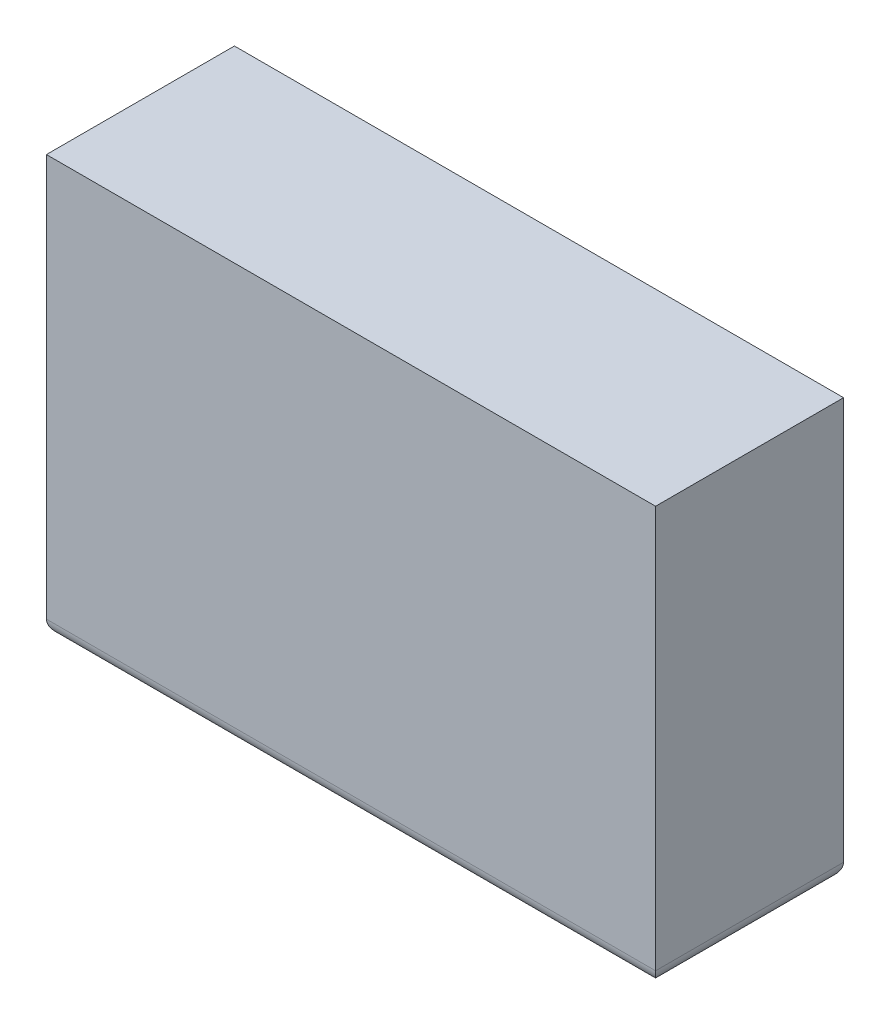
ISO-10303-21;
HEADER;
FILE_DESCRIPTION(('STEP AP214'),'2;1');
FILE_NAME('part.step','',(''),(''),'','','');
FILE_SCHEMA(('AUTOMOTIVE_DESIGN { 1 0 10303 214 1 1 1 1 }'));
ENDSEC;
DATA;
#1=APPLICATION_CONTEXT('core data for automotive mechanical design processes');
#2=APPLICATION_PROTOCOL_DEFINITION('international standard','automotive_design',2000,#1);
#3=PRODUCT_CONTEXT('',#1,'mechanical');
#4=PRODUCT('Part','Part','',(#3));
#5=PRODUCT_RELATED_PRODUCT_CATEGORY('part','',(#4));
#6=PRODUCT_DEFINITION_FORMATION('','',#4);
#7=PRODUCT_DEFINITION_CONTEXT('part definition',#1,'design');
#8=PRODUCT_DEFINITION('design','',#6,#7);
#9=PRODUCT_DEFINITION_SHAPE('','',#8);
#10=(LENGTH_UNIT() NAMED_UNIT(*) SI_UNIT(.MILLI.,.METRE.));
#11=(NAMED_UNIT(*) PLANE_ANGLE_UNIT() SI_UNIT($,.RADIAN.));
#12=(NAMED_UNIT(*) SI_UNIT($,.STERADIAN.) SOLID_ANGLE_UNIT());
#13=UNCERTAINTY_MEASURE_WITH_UNIT(LENGTH_MEASURE(1.E-05),#10,'distance_accuracy_value','');
#14=(GEOMETRIC_REPRESENTATION_CONTEXT(3) GLOBAL_UNCERTAINTY_ASSIGNED_CONTEXT((#13)) GLOBAL_UNIT_ASSIGNED_CONTEXT((#10,
#11,#12)) REPRESENTATION_CONTEXT('',''));
#15=CARTESIAN_POINT('',(0.,0.,0.));
#16=DIRECTION('',(0.,0.,1.));
#17=DIRECTION('',(1.,0.,0.));
#18=AXIS2_PLACEMENT_3D('',#15,#16,#17);
#19=CARTESIAN_POINT('',(-57.,-10.,-8.55043859649121));
#20=DIRECTION('',(0.,1.,0.));
#21=DIRECTION('',(0.,0.,1.));
#22=AXIS2_PLACEMENT_3D('',#19,#20,#21);
#23=CYLINDRICAL_SURFACE('',#22,5.);
#24=CARTESIAN_POINT('',(-57.,-10.,-8.55043859649121));
#25=DIRECTION('',(0.,1.,0.));
#26=DIRECTION('',(0.,0.,1.));
#27=AXIS2_PLACEMENT_3D('',#24,#25,#26);
#28=CIRCLE('',#27,5.);
#29=CARTESIAN_POINT('',(-57.,-10.,-3.55043859649121));
#30=VERTEX_POINT('',#29);
#31=EDGE_CURVE('E212',#30,#30,#28,.T.);
#32=ORIENTED_EDGE('',*,*,#31,.T.);
#33=EDGE_LOOP('',(#32));
#34=FACE_BOUND('',#33,.T.);
#35=CARTESIAN_POINT('',(-57.,0.,-8.55043859649121));
#36=DIRECTION('',(0.,1.,0.));
#37=DIRECTION('',(0.,0.,1.));
#38=AXIS2_PLACEMENT_3D('',#35,#36,#37);
#39=CIRCLE('',#38,5.);
#40=CARTESIAN_POINT('',(-57.,0.,-3.55043859649121));
#41=VERTEX_POINT('',#40);
#42=EDGE_CURVE('E147',#41,#41,#39,.T.);
#43=ORIENTED_EDGE('',*,*,#42,.F.);
#44=EDGE_LOOP('',(#43));
#45=FACE_BOUND('',#44,.T.);
#46=ADVANCED_FACE('F63',(#34,#45),#23,.T.);
#47=CARTESIAN_POINT('',(0.,-10.,0.));
#48=DIRECTION('',(0.,1.,0.));
#49=DIRECTION('',(0.,0.,1.));
#50=AXIS2_PLACEMENT_3D('',#47,#48,#49);
#51=PLANE('',#50);
#52=ORIENTED_EDGE('',*,*,#31,.F.);
#53=EDGE_LOOP('',(#52));
#54=FACE_BOUND('',#53,.T.);
#55=ADVANCED_FACE('F273',(#54),#51,.F.);
#56=CARTESIAN_POINT('',(-81.,4.,0.));
#57=DIRECTION('',(-1.,0.,0.));
#58=DIRECTION('',(0.,0.,1.));
#59=AXIS2_PLACEMENT_3D('',#56,#57,#58);
#60=PLANE('',#59);
#61=DIRECTION('',(0.,0.,-1.));
#62=VECTOR('',#61,1.);
#63=CARTESIAN_POINT('',(-81.,4.,16.4495614035088));
#64=LINE('',#63,#62);
#65=CARTESIAN_POINT('',(-81.,4.,-33.5504385964912));
#66=VERTEX_POINT('',#65);
#67=CARTESIAN_POINT('',(-81.,4.,16.4495614035088));
#68=VERTEX_POINT('',#67);
#69=EDGE_CURVE('E145',#66,#68,#64,.F.);
#70=ORIENTED_EDGE('',*,*,#69,.T.);
#71=DIRECTION('',(0.,-1.,0.));
#72=VECTOR('',#71,1.);
#73=CARTESIAN_POINT('',(-81.,4.,16.4495614035088));
#74=LINE('',#73,#72);
#75=CARTESIAN_POINT('',(-81.,111.,16.4495614035088));
#76=VERTEX_POINT('',#75);
#77=EDGE_CURVE('E86',#76,#68,#74,.T.);
#78=ORIENTED_EDGE('',*,*,#77,.F.);
#79=DIRECTION('',(0.,0.,1.));
#80=VECTOR('',#79,1.);
#81=CARTESIAN_POINT('',(-81.,111.,-33.5504385964912));
#82=LINE('',#81,#80);
#83=CARTESIAN_POINT('',(-81.,111.,-33.5504385964912));
#84=VERTEX_POINT('',#83);
#85=EDGE_CURVE('E143',#84,#76,#82,.T.);
#86=ORIENTED_EDGE('',*,*,#85,.F.);
#87=DIRECTION('',(0.,-1.,0.));
#88=VECTOR('',#87,1.);
#89=CARTESIAN_POINT('',(-81.,4.,-33.5504385964912));
#90=LINE('',#89,#88);
#91=EDGE_CURVE('E205',#84,#66,#90,.T.);
#92=ORIENTED_EDGE('',*,*,#91,.T.);
#93=EDGE_LOOP('',(#70,#78,#86,#92));
#94=FACE_BOUND('',#93,.T.);
#95=ADVANCED_FACE('F141',(#94),#60,.T.);
#96=CARTESIAN_POINT('',(0.,4.,16.4495614035088));
#97=DIRECTION('',(0.,0.,-1.));
#98=DIRECTION('',(-1.,0.,0.));
#99=AXIS2_PLACEMENT_3D('',#96,#97,#98);
#100=PLANE('',#99);
#101=DIRECTION('',(1.,0.,0.));
#102=VECTOR('',#101,1.);
#103=CARTESIAN_POINT('',(0.,4.,16.4495614035088));
#104=LINE('',#103,#102);
#105=CARTESIAN_POINT('',(81.,4.,16.4495614035088));
#106=VERTEX_POINT('',#105);
#107=EDGE_CURVE('E12',#68,#106,#104,.T.);
#108=ORIENTED_EDGE('',*,*,#107,.T.);
#109=DIRECTION('',(0.,-1.,0.));
#110=VECTOR('',#109,1.);
#111=CARTESIAN_POINT('',(81.,4.,16.4495614035088));
#112=LINE('',#111,#110);
#113=CARTESIAN_POINT('',(81.,111.,16.4495614035088));
#114=VERTEX_POINT('',#113);
#115=EDGE_CURVE('E80',#114,#106,#112,.T.);
#116=ORIENTED_EDGE('',*,*,#115,.F.);
#117=DIRECTION('',(1.,0.,0.));
#118=VECTOR('',#117,1.);
#119=CARTESIAN_POINT('',(-81.,111.,16.4495614035088));
#120=LINE('',#119,#118);
#121=EDGE_CURVE('E150',#76,#114,#120,.T.);
#122=ORIENTED_EDGE('',*,*,#121,.F.);
#123=ORIENTED_EDGE('',*,*,#77,.T.);
#124=EDGE_LOOP('',(#108,#116,#122,#123));
#125=FACE_BOUND('',#124,.T.);
#126=ADVANCED_FACE('F151',(#125),#100,.F.);
#127=CARTESIAN_POINT('',(81.,4.,0.));
#128=DIRECTION('',(-1.,0.,0.));
#129=DIRECTION('',(0.,0.,1.));
#130=AXIS2_PLACEMENT_3D('',#127,#128,#129);
#131=PLANE('',#130);
#132=DIRECTION('',(0.,0.,-1.));
#133=VECTOR('',#132,1.);
#134=CARTESIAN_POINT('',(81.,4.,0.));
#135=LINE('',#134,#133);
#136=CARTESIAN_POINT('',(81.,4.,-33.5504385964912));
#137=VERTEX_POINT('',#136);
#138=EDGE_CURVE('E72',#106,#137,#135,.T.);
#139=ORIENTED_EDGE('',*,*,#138,.T.);
#140=DIRECTION('',(0.,-1.,0.));
#141=VECTOR('',#140,1.);
#142=CARTESIAN_POINT('',(81.,4.,-33.5504385964912));
#143=LINE('',#142,#141);
#144=CARTESIAN_POINT('',(81.,111.,-33.5504385964912));
#145=VERTEX_POINT('',#144);
#146=EDGE_CURVE('E209',#145,#137,#143,.T.);
#147=ORIENTED_EDGE('',*,*,#146,.F.);
#148=DIRECTION('',(0.,0.,-1.));
#149=VECTOR('',#148,1.);
#150=CARTESIAN_POINT('',(81.,111.,-33.5504385964912));
#151=LINE('',#150,#149);
#152=EDGE_CURVE('E154',#114,#145,#151,.T.);
#153=ORIENTED_EDGE('',*,*,#152,.F.);
#154=ORIENTED_EDGE('',*,*,#115,.T.);
#155=EDGE_LOOP('',(#139,#147,#153,#154));
#156=FACE_BOUND('',#155,.T.);
#157=ADVANCED_FACE('F252',(#156),#131,.F.);
#158=CARTESIAN_POINT('',(0.,4.,-33.5504385964912));
#159=DIRECTION('',(0.,0.,-1.));
#160=DIRECTION('',(-1.,0.,0.));
#161=AXIS2_PLACEMENT_3D('',#158,#159,#160);
#162=PLANE('',#161);
#163=CARTESIAN_POINT('',(0.,53.4883121563414,-33.5504385964912));
#164=DIRECTION('',(0.,0.,-1.));
#165=DIRECTION('',(-1.,0.,0.));
#166=AXIS2_PLACEMENT_3D('',#163,#164,#165);
#167=CIRCLE('',#166,5.);
#168=CARTESIAN_POINT('',(-5.,53.4883121563414,-33.5504385964912));
#169=VERTEX_POINT('',#168);
#170=EDGE_CURVE('E164',#169,#169,#167,.T.);
#171=ORIENTED_EDGE('',*,*,#170,.F.);
#172=EDGE_LOOP('',(#171));
#173=FACE_BOUND('',#172,.T.);
#174=DIRECTION('',(1.,0.,0.));
#175=VECTOR('',#174,1.);
#176=CARTESIAN_POINT('',(-81.,4.,-33.5504385964912));
#177=LINE('',#176,#175);
#178=EDGE_CURVE('E226',#137,#66,#177,.F.);
#179=ORIENTED_EDGE('',*,*,#178,.T.);
#180=ORIENTED_EDGE('',*,*,#91,.F.);
#181=DIRECTION('',(-1.,0.,0.));
#182=VECTOR('',#181,1.);
#183=CARTESIAN_POINT('',(-81.,111.,-33.5504385964912));
#184=LINE('',#183,#182);
#185=EDGE_CURVE('E159',#145,#84,#184,.T.);
#186=ORIENTED_EDGE('',*,*,#185,.F.);
#187=ORIENTED_EDGE('',*,*,#146,.T.);
#188=EDGE_LOOP('',(#179,#180,#186,#187));
#189=FACE_BOUND('',#188,.T.);
#190=ADVANCED_FACE('F257',(#173,#189),#162,.T.);
#191=CARTESIAN_POINT('',(0.,0.,0.));
#192=DIRECTION('',(0.,1.,0.));
#193=DIRECTION('',(0.,0.,1.));
#194=AXIS2_PLACEMENT_3D('',#191,#192,#193);
#195=PLANE('',#194);
#196=DIRECTION('',(0.,0.,-1.));
#197=VECTOR('',#196,1.);
#198=CARTESIAN_POINT('',(-77.,0.,-33.5504385964912));
#199=LINE('',#198,#197);
#200=CARTESIAN_POINT('',(-77.,0.,12.4495614035088));
#201=VERTEX_POINT('',#200);
#202=CARTESIAN_POINT('',(-77.,0.,-29.5504385964912));
#203=VERTEX_POINT('',#202);
#204=EDGE_CURVE('E221',#201,#203,#199,.T.);
#205=ORIENTED_EDGE('',*,*,#204,.T.);
#206=DIRECTION('',(1.,0.,0.));
#207=VECTOR('',#206,1.);
#208=CARTESIAN_POINT('',(81.,0.,-29.5504385964912));
#209=LINE('',#208,#207);
#210=CARTESIAN_POINT('',(77.,0.,-29.5504385964912));
#211=VERTEX_POINT('',#210);
#212=EDGE_CURVE('E223',#203,#211,#209,.T.);
#213=ORIENTED_EDGE('',*,*,#212,.T.);
#214=DIRECTION('',(0.,0.,-1.));
#215=VECTOR('',#214,1.);
#216=CARTESIAN_POINT('',(77.,0.,0.));
#217=LINE('',#216,#215);
#218=CARTESIAN_POINT('',(77.,0.,12.4495614035088));
#219=VERTEX_POINT('',#218);
#220=EDGE_CURVE('E219',#211,#219,#217,.F.);
#221=ORIENTED_EDGE('',*,*,#220,.T.);
#222=DIRECTION('',(1.,0.,0.));
#223=VECTOR('',#222,1.);
#224=CARTESIAN_POINT('',(0.,0.,12.4495614035088));
#225=LINE('',#224,#223);
#226=EDGE_CURVE('E215',#219,#201,#225,.F.);
#227=ORIENTED_EDGE('',*,*,#226,.T.);
#228=EDGE_LOOP('',(#205,#213,#221,#227));
#229=FACE_BOUND('',#228,.T.);
#230=CARTESIAN_POINT('',(57.,0.,-8.55043859649122));
#231=DIRECTION('',(0.,1.,0.));
#232=DIRECTION('',(0.,0.,1.));
#233=AXIS2_PLACEMENT_3D('',#230,#231,#232);
#234=CIRCLE('',#233,5.);
#235=CARTESIAN_POINT('',(57.,0.,-3.55043859649122));
#236=VERTEX_POINT('',#235);
#237=EDGE_CURVE('E201',#236,#236,#234,.T.);
#238=ORIENTED_EDGE('',*,*,#237,.T.);
#239=EDGE_LOOP('',(#238));
#240=FACE_BOUND('',#239,.T.);
#241=ORIENTED_EDGE('',*,*,#42,.T.);
#242=EDGE_LOOP('',(#241));
#243=FACE_BOUND('',#242,.T.);
#244=ADVANCED_FACE('F259',(#229,#240,#243),#195,.F.);
#245=CARTESIAN_POINT('',(57.,-10.,-8.55043859649122));
#246=DIRECTION('',(0.,1.,0.));
#247=DIRECTION('',(0.,0.,1.));
#248=AXIS2_PLACEMENT_3D('',#245,#246,#247);
#249=CYLINDRICAL_SURFACE('',#248,5.);
#250=CARTESIAN_POINT('',(57.,-10.,-8.55043859649122));
#251=DIRECTION('',(0.,1.,0.));
#252=DIRECTION('',(0.,0.,1.));
#253=AXIS2_PLACEMENT_3D('',#250,#251,#252);
#254=CIRCLE('',#253,5.);
#255=CARTESIAN_POINT('',(57.,-10.,-3.55043859649122));
#256=VERTEX_POINT('',#255);
#257=EDGE_CURVE('E202',#256,#256,#254,.T.);
#258=ORIENTED_EDGE('',*,*,#257,.T.);
#259=EDGE_LOOP('',(#258));
#260=FACE_BOUND('',#259,.T.);
#261=ORIENTED_EDGE('',*,*,#237,.F.);
#262=EDGE_LOOP('',(#261));
#263=FACE_BOUND('',#262,.T.);
#264=ADVANCED_FACE('F267',(#260,#263),#249,.T.);
#265=CARTESIAN_POINT('',(0.,-10.,0.));
#266=DIRECTION('',(0.,1.,0.));
#267=DIRECTION('',(0.,0.,1.));
#268=AXIS2_PLACEMENT_3D('',#265,#266,#267);
#269=PLANE('',#268);
#270=ORIENTED_EDGE('',*,*,#257,.F.);
#271=EDGE_LOOP('',(#270));
#272=FACE_BOUND('',#271,.T.);
#273=ADVANCED_FACE('F292',(#272),#269,.F.);
#274=CARTESIAN_POINT('',(0.,4.,12.4495614035088));
#275=DIRECTION('',(1.,0.,0.));
#276=DIRECTION('',(0.,0.,-1.));
#277=AXIS2_PLACEMENT_3D('',#274,#275,#276);
#278=CYLINDRICAL_SURFACE('',#277,4.);
#279=CARTESIAN_POINT('',(77.,4.,12.4495614035088));
#280=DIRECTION('',(0.707106781186547,0.,-0.707106781186547));
#281=DIRECTION('',(0.707106781186547,0.,0.707106781186547));
#282=AXIS2_PLACEMENT_3D('',#279,#280,#281);
#283=ELLIPSE('',#282,5.65685424949238,4.);
#284=EDGE_CURVE('E235',#106,#219,#283,.T.);
#285=ORIENTED_EDGE('',*,*,#284,.F.);
#286=ORIENTED_EDGE('',*,*,#107,.F.);
#287=CARTESIAN_POINT('',(-77.,4.,12.4495614035088));
#288=DIRECTION('',(0.707106781186547,0.,0.707106781186547));
#289=DIRECTION('',(0.707106781186547,0.,-0.707106781186547));
#290=AXIS2_PLACEMENT_3D('',#287,#288,#289);
#291=ELLIPSE('',#290,5.65685424949238,4.);
#292=EDGE_CURVE('E183',#201,#68,#291,.F.);
#293=ORIENTED_EDGE('',*,*,#292,.F.);
#294=ORIENTED_EDGE('',*,*,#226,.F.);
#295=EDGE_LOOP('',(#285,#286,#293,#294));
#296=FACE_BOUND('',#295,.T.);
#297=ADVANCED_FACE('F65',(#296),#278,.T.);
#298=CARTESIAN_POINT('',(-77.,4.,0.));
#299=DIRECTION('',(0.,0.,1.));
#300=DIRECTION('',(1.,0.,0.));
#301=AXIS2_PLACEMENT_3D('',#298,#299,#300);
#302=CYLINDRICAL_SURFACE('',#301,4.);
#303=ORIENTED_EDGE('',*,*,#292,.T.);
#304=ORIENTED_EDGE('',*,*,#69,.F.);
#305=CARTESIAN_POINT('',(-77.,4.,-29.5504385964912));
#306=DIRECTION('',(-0.707106781186547,0.,0.707106781186547));
#307=DIRECTION('',(0.707106781186547,0.,0.707106781186547));
#308=AXIS2_PLACEMENT_3D('',#305,#306,#307);
#309=ELLIPSE('',#308,5.65685424949238,4.);
#310=EDGE_CURVE('E232',#203,#66,#309,.F.);
#311=ORIENTED_EDGE('',*,*,#310,.F.);
#312=ORIENTED_EDGE('',*,*,#204,.F.);
#313=EDGE_LOOP('',(#303,#304,#311,#312));
#314=FACE_BOUND('',#313,.T.);
#315=ADVANCED_FACE('F241',(#314),#302,.T.);
#316=CARTESIAN_POINT('',(77.,4.,0.));
#317=DIRECTION('',(0.,0.,-1.));
#318=DIRECTION('',(-1.,0.,0.));
#319=AXIS2_PLACEMENT_3D('',#316,#317,#318);
#320=CYLINDRICAL_SURFACE('',#319,4.);
#321=ORIENTED_EDGE('',*,*,#284,.T.);
#322=ORIENTED_EDGE('',*,*,#220,.F.);
#323=CARTESIAN_POINT('',(77.,4.,-29.5504385964912));
#324=DIRECTION('',(-0.707106781186547,0.,-0.707106781186547));
#325=DIRECTION('',(0.707106781186547,0.,-0.707106781186547));
#326=AXIS2_PLACEMENT_3D('',#323,#324,#325);
#327=ELLIPSE('',#326,5.65685424949238,4.);
#328=EDGE_CURVE('E179',#137,#211,#327,.T.);
#329=ORIENTED_EDGE('',*,*,#328,.F.);
#330=ORIENTED_EDGE('',*,*,#138,.F.);
#331=EDGE_LOOP('',(#321,#322,#329,#330));
#332=FACE_BOUND('',#331,.T.);
#333=ADVANCED_FACE('F250',(#332),#320,.T.);
#334=CARTESIAN_POINT('',(0.,4.,-29.5504385964912));
#335=DIRECTION('',(-1.,0.,0.));
#336=DIRECTION('',(0.,0.,1.));
#337=AXIS2_PLACEMENT_3D('',#334,#335,#336);
#338=CYLINDRICAL_SURFACE('',#337,4.);
#339=ORIENTED_EDGE('',*,*,#310,.T.);
#340=ORIENTED_EDGE('',*,*,#178,.F.);
#341=ORIENTED_EDGE('',*,*,#328,.T.);
#342=ORIENTED_EDGE('',*,*,#212,.F.);
#343=EDGE_LOOP('',(#339,#340,#341,#342));
#344=FACE_BOUND('',#343,.T.);
#345=ADVANCED_FACE('F254',(#344),#338,.T.);
#346=CARTESIAN_POINT('',(0.,4.,0.));
#347=DIRECTION('',(0.,1.,0.));
#348=DIRECTION('',(0.,0.,1.));
#349=AXIS2_PLACEMENT_3D('',#346,#347,#348);
#350=PLANE('',#349);
#351=DIRECTION('',(0.,0.,1.));
#352=VECTOR('',#351,1.);
#353=CARTESIAN_POINT('',(77.,4.,0.));
#354=LINE('',#353,#352);
#355=CARTESIAN_POINT('',(77.,4.,-29.5504385964912));
#356=VERTEX_POINT('',#355);
#357=CARTESIAN_POINT('',(77.,4.,12.4495614035088));
#358=VERTEX_POINT('',#357);
#359=EDGE_CURVE('E198',#356,#358,#354,.T.);
#360=ORIENTED_EDGE('',*,*,#359,.F.);
#361=DIRECTION('',(-1.,0.,0.));
#362=VECTOR('',#361,1.);
#363=CARTESIAN_POINT('',(0.,4.,-29.5504385964912));
#364=LINE('',#363,#362);
#365=CARTESIAN_POINT('',(-77.,4.,-29.5504385964912));
#366=VERTEX_POINT('',#365);
#367=EDGE_CURVE('E189',#356,#366,#364,.T.);
#368=ORIENTED_EDGE('',*,*,#367,.T.);
#369=DIRECTION('',(0.,0.,1.));
#370=VECTOR('',#369,1.);
#371=CARTESIAN_POINT('',(-77.,4.,0.));
#372=LINE('',#371,#370);
#373=CARTESIAN_POINT('',(-77.,4.,12.4495614035088));
#374=VERTEX_POINT('',#373);
#375=EDGE_CURVE('E192',#366,#374,#372,.T.);
#376=ORIENTED_EDGE('',*,*,#375,.T.);
#377=DIRECTION('',(-1.,0.,0.));
#378=VECTOR('',#377,1.);
#379=CARTESIAN_POINT('',(0.,4.,12.4495614035088));
#380=LINE('',#379,#378);
#381=EDGE_CURVE('E195',#358,#374,#380,.T.);
#382=ORIENTED_EDGE('',*,*,#381,.F.);
#383=EDGE_LOOP('',(#360,#368,#376,#382));
#384=FACE_BOUND('',#383,.T.);
#385=ADVANCED_FACE('F286',(#384),#350,.T.);
#386=CARTESIAN_POINT('',(0.,96.,-29.5504385964912));
#387=DIRECTION('',(0.,0.,-1.));
#388=DIRECTION('',(-1.,0.,0.));
#389=AXIS2_PLACEMENT_3D('',#386,#387,#388);
#390=PLANE('',#389);
#391=CARTESIAN_POINT('',(0.,53.4883121563414,-29.5504385964912));
#392=DIRECTION('',(0.,0.,-1.));
#393=DIRECTION('',(-1.,0.,0.));
#394=AXIS2_PLACEMENT_3D('',#391,#392,#393);
#395=CIRCLE('',#394,5.);
#396=CARTESIAN_POINT('',(-5.,53.4883121563414,-29.5504385964912));
#397=VERTEX_POINT('',#396);
#398=EDGE_CURVE('E67',#397,#397,#395,.T.);
#399=ORIENTED_EDGE('',*,*,#398,.T.);
#400=EDGE_LOOP('',(#399));
#401=FACE_BOUND('',#400,.T.);
#402=ORIENTED_EDGE('',*,*,#367,.F.);
#403=DIRECTION('',(0.,-1.,0.));
#404=VECTOR('',#403,1.);
#405=CARTESIAN_POINT('',(77.,96.,-29.5504385964912));
#406=LINE('',#405,#404);
#407=CARTESIAN_POINT('',(77.,101.,-29.5504385964912));
#408=VERTEX_POINT('',#407);
#409=EDGE_CURVE('E180',#408,#356,#406,.T.);
#410=ORIENTED_EDGE('',*,*,#409,.F.);
#411=DIRECTION('',(1.,0.,0.));
#412=VECTOR('',#411,1.);
#413=CARTESIAN_POINT('',(0.,101.,-29.5504385964912));
#414=LINE('',#413,#412);
#415=CARTESIAN_POINT('',(-77.,101.,-29.5504385964912));
#416=VERTEX_POINT('',#415);
#417=EDGE_CURVE('E170',#416,#408,#414,.T.);
#418=ORIENTED_EDGE('',*,*,#417,.F.);
#419=DIRECTION('',(0.,-1.,0.));
#420=VECTOR('',#419,1.);
#421=CARTESIAN_POINT('',(-77.,96.,-29.5504385964912));
#422=LINE('',#421,#420);
#423=EDGE_CURVE('E182',#416,#366,#422,.T.);
#424=ORIENTED_EDGE('',*,*,#423,.T.);
#425=EDGE_LOOP('',(#402,#410,#418,#424));
#426=FACE_BOUND('',#425,.T.);
#427=ADVANCED_FACE('F309',(#401,#426),#390,.F.);
#428=CARTESIAN_POINT('',(-77.,96.,0.));
#429=DIRECTION('',(-1.,0.,0.));
#430=DIRECTION('',(0.,0.,1.));
#431=AXIS2_PLACEMENT_3D('',#428,#429,#430);
#432=PLANE('',#431);
#433=ORIENTED_EDGE('',*,*,#375,.F.);
#434=ORIENTED_EDGE('',*,*,#423,.F.);
#435=DIRECTION('',(0.,0.,-1.));
#436=VECTOR('',#435,1.);
#437=CARTESIAN_POINT('',(-77.,101.,0.));
#438=LINE('',#437,#436);
#439=CARTESIAN_POINT('',(-77.,101.,12.4495614035088));
#440=VERTEX_POINT('',#439);
#441=EDGE_CURVE('E173',#440,#416,#438,.T.);
#442=ORIENTED_EDGE('',*,*,#441,.F.);
#443=DIRECTION('',(0.,-1.,0.));
#444=VECTOR('',#443,1.);
#445=CARTESIAN_POINT('',(-77.,96.,12.4495614035088));
#446=LINE('',#445,#444);
#447=EDGE_CURVE('E185',#440,#374,#446,.T.);
#448=ORIENTED_EDGE('',*,*,#447,.T.);
#449=EDGE_LOOP('',(#433,#434,#442,#448));
#450=FACE_BOUND('',#449,.T.);
#451=ADVANCED_FACE('F314',(#450),#432,.F.);
#452=CARTESIAN_POINT('',(0.,96.,12.4495614035088));
#453=DIRECTION('',(0.,0.,-1.));
#454=DIRECTION('',(-1.,0.,0.));
#455=AXIS2_PLACEMENT_3D('',#452,#453,#454);
#456=PLANE('',#455);
#457=ORIENTED_EDGE('',*,*,#381,.T.);
#458=ORIENTED_EDGE('',*,*,#447,.F.);
#459=DIRECTION('',(-1.,0.,0.));
#460=VECTOR('',#459,1.);
#461=CARTESIAN_POINT('',(0.,101.,12.4495614035088));
#462=LINE('',#461,#460);
#463=CARTESIAN_POINT('',(77.,101.,12.4495614035088));
#464=VERTEX_POINT('',#463);
#465=EDGE_CURVE('E176',#464,#440,#462,.T.);
#466=ORIENTED_EDGE('',*,*,#465,.F.);
#467=DIRECTION('',(0.,-1.,0.));
#468=VECTOR('',#467,1.);
#469=CARTESIAN_POINT('',(77.,96.,12.4495614035088));
#470=LINE('',#469,#468);
#471=EDGE_CURVE('E187',#464,#358,#470,.T.);
#472=ORIENTED_EDGE('',*,*,#471,.T.);
#473=EDGE_LOOP('',(#457,#458,#466,#472));
#474=FACE_BOUND('',#473,.T.);
#475=ADVANCED_FACE('F329',(#474),#456,.T.);
#476=CARTESIAN_POINT('',(77.,96.,0.));
#477=DIRECTION('',(-1.,0.,0.));
#478=DIRECTION('',(0.,0.,1.));
#479=AXIS2_PLACEMENT_3D('',#476,#477,#478);
#480=PLANE('',#479);
#481=ORIENTED_EDGE('',*,*,#359,.T.);
#482=ORIENTED_EDGE('',*,*,#471,.F.);
#483=DIRECTION('',(0.,0.,1.));
#484=VECTOR('',#483,1.);
#485=CARTESIAN_POINT('',(77.,101.,0.));
#486=LINE('',#485,#484);
#487=EDGE_CURVE('E167',#408,#464,#486,.T.);
#488=ORIENTED_EDGE('',*,*,#487,.F.);
#489=ORIENTED_EDGE('',*,*,#409,.T.);
#490=EDGE_LOOP('',(#481,#482,#488,#489));
#491=FACE_BOUND('',#490,.T.);
#492=ADVANCED_FACE('F306',(#491),#480,.T.);
#493=CARTESIAN_POINT('',(0.,53.4883121563414,-23.5504385964912));
#494=DIRECTION('',(0.,0.,-1.));
#495=DIRECTION('',(-1.,0.,0.));
#496=AXIS2_PLACEMENT_3D('',#493,#494,#495);
#497=CYLINDRICAL_SURFACE('',#496,5.);
#498=ORIENTED_EDGE('',*,*,#170,.T.);
#499=EDGE_LOOP('',(#498));
#500=FACE_BOUND('',#499,.T.);
#501=ORIENTED_EDGE('',*,*,#398,.F.);
#502=EDGE_LOOP('',(#501));
#503=FACE_BOUND('',#502,.T.);
#504=ADVANCED_FACE('F333',(#500,#503),#497,.F.);
#505=CARTESIAN_POINT('',(0.,101.,0.));
#506=DIRECTION('',(0.,1.,0.));
#507=DIRECTION('',(0.,0.,1.));
#508=AXIS2_PLACEMENT_3D('',#505,#506,#507);
#509=PLANE('',#508);
#510=ORIENTED_EDGE('',*,*,#417,.T.);
#511=ORIENTED_EDGE('',*,*,#487,.T.);
#512=ORIENTED_EDGE('',*,*,#465,.T.);
#513=ORIENTED_EDGE('',*,*,#441,.T.);
#514=EDGE_LOOP('',(#510,#511,#512,#513));
#515=FACE_BOUND('',#514,.T.);
#516=ADVANCED_FACE('F331',(#515),#509,.F.);
#517=CARTESIAN_POINT('',(0.,111.,0.));
#518=DIRECTION('',(0.,1.,0.));
#519=DIRECTION('',(0.,0.,1.));
#520=AXIS2_PLACEMENT_3D('',#517,#518,#519);
#521=PLANE('',#520);
#522=ORIENTED_EDGE('',*,*,#85,.T.);
#523=ORIENTED_EDGE('',*,*,#121,.T.);
#524=ORIENTED_EDGE('',*,*,#152,.T.);
#525=ORIENTED_EDGE('',*,*,#185,.T.);
#526=EDGE_LOOP('',(#522,#523,#524,#525));
#527=FACE_BOUND('',#526,.T.);
#528=ADVANCED_FACE('F157',(#527),#521,.T.);
#529=CLOSED_SHELL('',(#46,#55,#95,#126,#157,#190,#244,#264,#273,#297,#315,#333,#345,#385,#427,
#451,#475,#492,#504,#516,#528));
#530=MANIFOLD_SOLID_BREP('B2',#529);
#531=ADVANCED_BREP_SHAPE_REPRESENTATION('',(#18,#530),#14);
#532=SHAPE_DEFINITION_REPRESENTATION(#9,#531);
ENDSEC;
END-ISO-10303-21;
